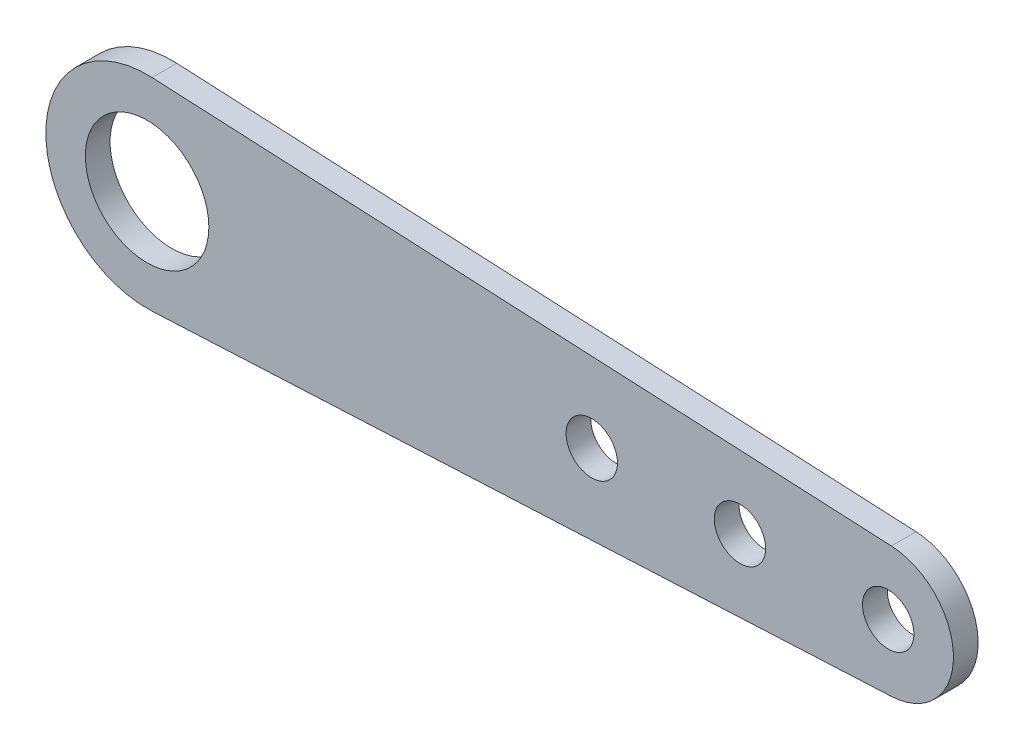
ISO-10303-21;
HEADER;
FILE_DESCRIPTION(('STEP AP214'),'2;1');
FILE_NAME('part.step','',(''),(''),'','','');
FILE_SCHEMA(('AUTOMOTIVE_DESIGN { 1 0 10303 214 1 1 1 1 }'));
ENDSEC;
DATA;
#1=APPLICATION_CONTEXT('core data for automotive mechanical design processes');
#2=APPLICATION_PROTOCOL_DEFINITION('international standard','automotive_design',2000,#1);
#3=PRODUCT_CONTEXT('',#1,'mechanical');
#4=PRODUCT('Part','Part','',(#3));
#5=PRODUCT_RELATED_PRODUCT_CATEGORY('part','',(#4));
#6=PRODUCT_DEFINITION_FORMATION('','',#4);
#7=PRODUCT_DEFINITION_CONTEXT('part definition',#1,'design');
#8=PRODUCT_DEFINITION('design','',#6,#7);
#9=PRODUCT_DEFINITION_SHAPE('','',#8);
#10=(LENGTH_UNIT() NAMED_UNIT(*) SI_UNIT(.MILLI.,.METRE.));
#11=(NAMED_UNIT(*) PLANE_ANGLE_UNIT() SI_UNIT($,.RADIAN.));
#12=(NAMED_UNIT(*) SI_UNIT($,.STERADIAN.) SOLID_ANGLE_UNIT());
#13=UNCERTAINTY_MEASURE_WITH_UNIT(LENGTH_MEASURE(1.E-05),#10,'distance_accuracy_value','');
#14=(GEOMETRIC_REPRESENTATION_CONTEXT(3) GLOBAL_UNCERTAINTY_ASSIGNED_CONTEXT((#13)) GLOBAL_UNIT_ASSIGNED_CONTEXT((#10,
#11,#12)) REPRESENTATION_CONTEXT('',''));
#15=CARTESIAN_POINT('',(0.,0.,0.));
#16=DIRECTION('',(0.,0.,1.));
#17=DIRECTION('',(1.,0.,0.));
#18=AXIS2_PLACEMENT_3D('',#15,#16,#17);
#19=CARTESIAN_POINT('',(0.,0.,3.175));
#20=DIRECTION('',(0.,0.,1.));
#21=DIRECTION('',(1.,0.,0.));
#22=AXIS2_PLACEMENT_3D('',#19,#20,#21);
#23=PLANE('',#22);
#24=CARTESIAN_POINT('',(76.2,0.,3.175));
#25=DIRECTION('',(0.,0.,1.));
#26=DIRECTION('',(1.,0.,0.));
#27=AXIS2_PLACEMENT_3D('',#24,#25,#26);
#28=CIRCLE('',#27,3.302);
#29=CARTESIAN_POINT('',(79.502,0.,3.175));
#30=VERTEX_POINT('',#29);
#31=EDGE_CURVE('E129',#30,#30,#28,.T.);
#32=ORIENTED_EDGE('',*,*,#31,.F.);
#33=EDGE_LOOP('',(#32));
#34=FACE_BOUND('',#33,.T.);
#35=CARTESIAN_POINT('',(0.,0.,3.175));
#36=DIRECTION('',(0.,0.,1.));
#37=DIRECTION('',(1.,0.,0.));
#38=AXIS2_PLACEMENT_3D('',#35,#36,#37);
#39=CIRCLE('',#38,7.9375);
#40=CARTESIAN_POINT('',(7.9375,0.,3.175));
#41=VERTEX_POINT('',#40);
#42=EDGE_CURVE('E108',#41,#41,#39,.T.);
#43=ORIENTED_EDGE('',*,*,#42,.F.);
#44=EDGE_LOOP('',(#43));
#45=FACE_BOUND('',#44,.T.);
#46=CARTESIAN_POINT('',(0.,0.,3.175));
#47=DIRECTION('',(0.,0.,1.));
#48=DIRECTION('',(1.,0.,0.));
#49=AXIS2_PLACEMENT_3D('',#46,#47,#48);
#50=CIRCLE('',#49,13.0175);
#51=CARTESIAN_POINT('',(0.633518333333333,13.0020752486413,3.175));
#52=VERTEX_POINT('',#51);
#53=CARTESIAN_POINT('',(0.633518333333333,-13.0020752486413,3.175));
#54=VERTEX_POINT('',#53);
#55=EDGE_CURVE('E93',#52,#54,#50,.T.);
#56=ORIENTED_EDGE('',*,*,#55,.T.);
#57=DIRECTION('',(0.998815075755045,0.0486666666666666,0.));
#58=VECTOR('',#57,1.);
#59=CARTESIAN_POINT('',(0.633518333333333,-13.0020752486413,3.175));
#60=LINE('',#59,#58);
#61=CARTESIAN_POINT('',(95.657924,-8.37206796497878,3.175));
#62=VERTEX_POINT('',#61);
#63=EDGE_CURVE('E88',#54,#62,#60,.T.);
#64=ORIENTED_EDGE('',*,*,#63,.T.);
#65=CARTESIAN_POINT('',(95.25,0.,3.175));
#66=DIRECTION('',(0.,0.,1.));
#67=DIRECTION('',(1.,0.,0.));
#68=AXIS2_PLACEMENT_3D('',#65,#66,#67);
#69=CIRCLE('',#68,8.382);
#70=CARTESIAN_POINT('',(95.657924,8.37206796497878,3.175));
#71=VERTEX_POINT('',#70);
#72=EDGE_CURVE('E91',#62,#71,#69,.T.);
#73=ORIENTED_EDGE('',*,*,#72,.T.);
#74=DIRECTION('',(-0.998815075755045,0.0486666666666666,0.));
#75=VECTOR('',#74,1.);
#76=CARTESIAN_POINT('',(0.633518333333333,13.0020752486413,3.175));
#77=LINE('',#76,#75);
#78=EDGE_CURVE('E58',#71,#52,#77,.T.);
#79=ORIENTED_EDGE('',*,*,#78,.T.);
#80=EDGE_LOOP('',(#56,#64,#73,#79));
#81=FACE_BOUND('',#80,.T.);
#82=CARTESIAN_POINT('',(57.15,0.,3.175));
#83=DIRECTION('',(0.,0.,1.));
#84=DIRECTION('',(1.,0.,0.));
#85=AXIS2_PLACEMENT_3D('',#82,#83,#84);
#86=CIRCLE('',#85,3.302);
#87=CARTESIAN_POINT('',(60.452,0.,3.175));
#88=VERTEX_POINT('',#87);
#89=EDGE_CURVE('E123',#88,#88,#86,.T.);
#90=ORIENTED_EDGE('',*,*,#89,.F.);
#91=EDGE_LOOP('',(#90));
#92=FACE_BOUND('',#91,.T.);
#93=CARTESIAN_POINT('',(95.25,0.,3.175));
#94=DIRECTION('',(0.,0.,1.));
#95=DIRECTION('',(1.,0.,0.));
#96=AXIS2_PLACEMENT_3D('',#93,#94,#95);
#97=CIRCLE('',#96,3.30200000000001);
#98=CARTESIAN_POINT('',(98.552,0.,3.175));
#99=VERTEX_POINT('',#98);
#100=EDGE_CURVE('E135',#99,#99,#97,.T.);
#101=ORIENTED_EDGE('',*,*,#100,.F.);
#102=EDGE_LOOP('',(#101));
#103=FACE_BOUND('',#102,.T.);
#104=ADVANCED_FACE('F41',(#34,#45,#81,#92,#103),#23,.T.);
#105=CARTESIAN_POINT('',(0.,0.,0.));
#106=DIRECTION('',(0.,0.,1.));
#107=DIRECTION('',(1.,0.,0.));
#108=AXIS2_PLACEMENT_3D('',#105,#106,#107);
#109=PLANE('',#108);
#110=CARTESIAN_POINT('',(0.,0.,0.));
#111=DIRECTION('',(0.,0.,1.));
#112=DIRECTION('',(1.,0.,0.));
#113=AXIS2_PLACEMENT_3D('',#110,#111,#112);
#114=CIRCLE('',#113,13.0175);
#115=CARTESIAN_POINT('',(0.633518333333333,13.0020752486413,0.));
#116=VERTEX_POINT('',#115);
#117=CARTESIAN_POINT('',(0.633518333333333,-13.0020752486413,0.));
#118=VERTEX_POINT('',#117);
#119=EDGE_CURVE('E105',#116,#118,#114,.T.);
#120=ORIENTED_EDGE('',*,*,#119,.F.);
#121=DIRECTION('',(-0.998815075755045,0.0486666666666666,0.));
#122=VECTOR('',#121,1.);
#123=CARTESIAN_POINT('',(0.633518333333333,13.0020752486413,0.));
#124=LINE('',#123,#122);
#125=CARTESIAN_POINT('',(95.657924,8.37206796497878,0.));
#126=VERTEX_POINT('',#125);
#127=EDGE_CURVE('E81',#126,#116,#124,.T.);
#128=ORIENTED_EDGE('',*,*,#127,.F.);
#129=CARTESIAN_POINT('',(95.25,0.,0.));
#130=DIRECTION('',(0.,0.,1.));
#131=DIRECTION('',(1.,0.,0.));
#132=AXIS2_PLACEMENT_3D('',#129,#130,#131);
#133=CIRCLE('',#132,8.382);
#134=CARTESIAN_POINT('',(95.657924,-8.37206796497878,0.));
#135=VERTEX_POINT('',#134);
#136=EDGE_CURVE('E75',#135,#126,#133,.T.);
#137=ORIENTED_EDGE('',*,*,#136,.F.);
#138=DIRECTION('',(0.998815075755045,0.0486666666666666,0.));
#139=VECTOR('',#138,1.);
#140=CARTESIAN_POINT('',(0.633518333333333,-13.0020752486413,0.));
#141=LINE('',#140,#139);
#142=EDGE_CURVE('E97',#118,#135,#141,.T.);
#143=ORIENTED_EDGE('',*,*,#142,.F.);
#144=EDGE_LOOP('',(#120,#128,#137,#143));
#145=FACE_BOUND('',#144,.T.);
#146=CARTESIAN_POINT('',(0.,0.,0.));
#147=DIRECTION('',(0.,0.,1.));
#148=DIRECTION('',(1.,0.,0.));
#149=AXIS2_PLACEMENT_3D('',#146,#147,#148);
#150=CIRCLE('',#149,7.9375);
#151=CARTESIAN_POINT('',(7.9375,0.,0.));
#152=VERTEX_POINT('',#151);
#153=EDGE_CURVE('E120',#152,#152,#150,.T.);
#154=ORIENTED_EDGE('',*,*,#153,.T.);
#155=EDGE_LOOP('',(#154));
#156=FACE_BOUND('',#155,.T.);
#157=CARTESIAN_POINT('',(57.15,0.,0.));
#158=DIRECTION('',(0.,0.,1.));
#159=DIRECTION('',(1.,0.,0.));
#160=AXIS2_PLACEMENT_3D('',#157,#158,#159);
#161=CIRCLE('',#160,3.302);
#162=CARTESIAN_POINT('',(60.452,0.,0.));
#163=VERTEX_POINT('',#162);
#164=EDGE_CURVE('E126',#163,#163,#161,.T.);
#165=ORIENTED_EDGE('',*,*,#164,.T.);
#166=EDGE_LOOP('',(#165));
#167=FACE_BOUND('',#166,.T.);
#168=CARTESIAN_POINT('',(76.2,0.,0.));
#169=DIRECTION('',(0.,0.,1.));
#170=DIRECTION('',(1.,0.,0.));
#171=AXIS2_PLACEMENT_3D('',#168,#169,#170);
#172=CIRCLE('',#171,3.302);
#173=CARTESIAN_POINT('',(79.502,0.,0.));
#174=VERTEX_POINT('',#173);
#175=EDGE_CURVE('E132',#174,#174,#172,.T.);
#176=ORIENTED_EDGE('',*,*,#175,.T.);
#177=EDGE_LOOP('',(#176));
#178=FACE_BOUND('',#177,.T.);
#179=CARTESIAN_POINT('',(95.25,0.,0.));
#180=DIRECTION('',(0.,0.,1.));
#181=DIRECTION('',(1.,0.,0.));
#182=AXIS2_PLACEMENT_3D('',#179,#180,#181);
#183=CIRCLE('',#182,3.30200000000001);
#184=CARTESIAN_POINT('',(98.552,0.,0.));
#185=VERTEX_POINT('',#184);
#186=EDGE_CURVE('E138',#185,#185,#183,.T.);
#187=ORIENTED_EDGE('',*,*,#186,.T.);
#188=EDGE_LOOP('',(#187));
#189=FACE_BOUND('',#188,.T.);
#190=ADVANCED_FACE('F116',(#145,#156,#167,#178,#189),#109,.F.);
#191=CARTESIAN_POINT('',(0.,0.,3.175));
#192=DIRECTION('',(0.,0.,-1.));
#193=DIRECTION('',(-1.,0.,0.));
#194=AXIS2_PLACEMENT_3D('',#191,#192,#193);
#195=CYLINDRICAL_SURFACE('',#194,13.0175);
#196=ORIENTED_EDGE('',*,*,#119,.T.);
#197=DIRECTION('',(0.,0.,-1.));
#198=VECTOR('',#197,1.);
#199=CARTESIAN_POINT('',(0.633518333333333,-13.0020752486413,3.175));
#200=LINE('',#199,#198);
#201=EDGE_CURVE('E11',#54,#118,#200,.T.);
#202=ORIENTED_EDGE('',*,*,#201,.F.);
#203=ORIENTED_EDGE('',*,*,#55,.F.);
#204=DIRECTION('',(0.,0.,-1.));
#205=VECTOR('',#204,1.);
#206=CARTESIAN_POINT('',(0.633518333333333,13.0020752486413,3.175));
#207=LINE('',#206,#205);
#208=EDGE_CURVE('E101',#52,#116,#207,.T.);
#209=ORIENTED_EDGE('',*,*,#208,.T.);
#210=EDGE_LOOP('',(#196,#202,#203,#209));
#211=FACE_BOUND('',#210,.T.);
#212=ADVANCED_FACE('F43',(#211),#195,.T.);
#213=CARTESIAN_POINT('',(0.633518333333333,-13.0020752486413,3.175));
#214=DIRECTION('',(-0.0486666666666666,0.998815075755045,0.));
#215=DIRECTION('',(-0.998815075755045,-0.0486666666666666,0.));
#216=AXIS2_PLACEMENT_3D('',#213,#214,#215);
#217=PLANE('',#216);
#218=ORIENTED_EDGE('',*,*,#142,.T.);
#219=DIRECTION('',(0.,0.,-1.));
#220=VECTOR('',#219,1.);
#221=CARTESIAN_POINT('',(95.657924,-8.37206796497878,3.175));
#222=LINE('',#221,#220);
#223=EDGE_CURVE('E50',#62,#135,#222,.T.);
#224=ORIENTED_EDGE('',*,*,#223,.F.);
#225=ORIENTED_EDGE('',*,*,#63,.F.);
#226=ORIENTED_EDGE('',*,*,#201,.T.);
#227=EDGE_LOOP('',(#218,#224,#225,#226));
#228=FACE_BOUND('',#227,.T.);
#229=ADVANCED_FACE('F96',(#228),#217,.F.);
#230=CARTESIAN_POINT('',(95.25,0.,3.175));
#231=DIRECTION('',(0.,0.,-1.));
#232=DIRECTION('',(-1.,0.,0.));
#233=AXIS2_PLACEMENT_3D('',#230,#231,#232);
#234=CYLINDRICAL_SURFACE('',#233,8.382);
#235=ORIENTED_EDGE('',*,*,#136,.T.);
#236=DIRECTION('',(0.,0.,-1.));
#237=VECTOR('',#236,1.);
#238=CARTESIAN_POINT('',(95.657924,8.37206796497878,3.175));
#239=LINE('',#238,#237);
#240=EDGE_CURVE('E98',#71,#126,#239,.T.);
#241=ORIENTED_EDGE('',*,*,#240,.F.);
#242=ORIENTED_EDGE('',*,*,#72,.F.);
#243=ORIENTED_EDGE('',*,*,#223,.T.);
#244=EDGE_LOOP('',(#235,#241,#242,#243));
#245=FACE_BOUND('',#244,.T.);
#246=ADVANCED_FACE('F99',(#245),#234,.T.);
#247=CARTESIAN_POINT('',(0.633518333333333,13.0020752486413,3.175));
#248=DIRECTION('',(-0.0486666666666666,-0.998815075755045,0.));
#249=DIRECTION('',(0.998815075755045,-0.0486666666666666,0.));
#250=AXIS2_PLACEMENT_3D('',#247,#248,#249);
#251=PLANE('',#250);
#252=ORIENTED_EDGE('',*,*,#127,.T.);
#253=ORIENTED_EDGE('',*,*,#208,.F.);
#254=ORIENTED_EDGE('',*,*,#78,.F.);
#255=ORIENTED_EDGE('',*,*,#240,.T.);
#256=EDGE_LOOP('',(#252,#253,#254,#255));
#257=FACE_BOUND('',#256,.T.);
#258=ADVANCED_FACE('F113',(#257),#251,.F.);
#259=CARTESIAN_POINT('',(0.,0.,3.175));
#260=DIRECTION('',(0.,0.,-1.));
#261=DIRECTION('',(-1.,0.,0.));
#262=AXIS2_PLACEMENT_3D('',#259,#260,#261);
#263=CYLINDRICAL_SURFACE('',#262,7.9375);
#264=ORIENTED_EDGE('',*,*,#42,.T.);
#265=EDGE_LOOP('',(#264));
#266=FACE_BOUND('',#265,.T.);
#267=ORIENTED_EDGE('',*,*,#153,.F.);
#268=EDGE_LOOP('',(#267));
#269=FACE_BOUND('',#268,.T.);
#270=ADVANCED_FACE('F157',(#266,#269),#263,.F.);
#271=CARTESIAN_POINT('',(57.15,0.,3.175));
#272=DIRECTION('',(0.,0.,-1.));
#273=DIRECTION('',(-1.,0.,0.));
#274=AXIS2_PLACEMENT_3D('',#271,#272,#273);
#275=CYLINDRICAL_SURFACE('',#274,3.302);
#276=ORIENTED_EDGE('',*,*,#89,.T.);
#277=EDGE_LOOP('',(#276));
#278=FACE_BOUND('',#277,.T.);
#279=ORIENTED_EDGE('',*,*,#164,.F.);
#280=EDGE_LOOP('',(#279));
#281=FACE_BOUND('',#280,.T.);
#282=ADVANCED_FACE('F202',(#278,#281),#275,.F.);
#283=CARTESIAN_POINT('',(76.2,0.,3.175));
#284=DIRECTION('',(0.,0.,-1.));
#285=DIRECTION('',(-1.,0.,0.));
#286=AXIS2_PLACEMENT_3D('',#283,#284,#285);
#287=CYLINDRICAL_SURFACE('',#286,3.302);
#288=ORIENTED_EDGE('',*,*,#31,.T.);
#289=EDGE_LOOP('',(#288));
#290=FACE_BOUND('',#289,.T.);
#291=ORIENTED_EDGE('',*,*,#175,.F.);
#292=EDGE_LOOP('',(#291));
#293=FACE_BOUND('',#292,.T.);
#294=ADVANCED_FACE('F210',(#290,#293),#287,.F.);
#295=CARTESIAN_POINT('',(95.25,0.,3.175));
#296=DIRECTION('',(0.,0.,-1.));
#297=DIRECTION('',(-1.,0.,0.));
#298=AXIS2_PLACEMENT_3D('',#295,#296,#297);
#299=CYLINDRICAL_SURFACE('',#298,3.30200000000001);
#300=ORIENTED_EDGE('',*,*,#100,.T.);
#301=EDGE_LOOP('',(#300));
#302=FACE_BOUND('',#301,.T.);
#303=ORIENTED_EDGE('',*,*,#186,.F.);
#304=EDGE_LOOP('',(#303));
#305=FACE_BOUND('',#304,.T.);
#306=ADVANCED_FACE('F144',(#302,#305),#299,.F.);
#307=CLOSED_SHELL('',(#104,#190,#212,#229,#246,#258,#270,#282,#294,#306));
#308=MANIFOLD_SOLID_BREP('B2',#307);
#309=ADVANCED_BREP_SHAPE_REPRESENTATION('',(#18,#308),#14);
#310=SHAPE_DEFINITION_REPRESENTATION(#9,#309);
ENDSEC;
END-ISO-10303-21;
